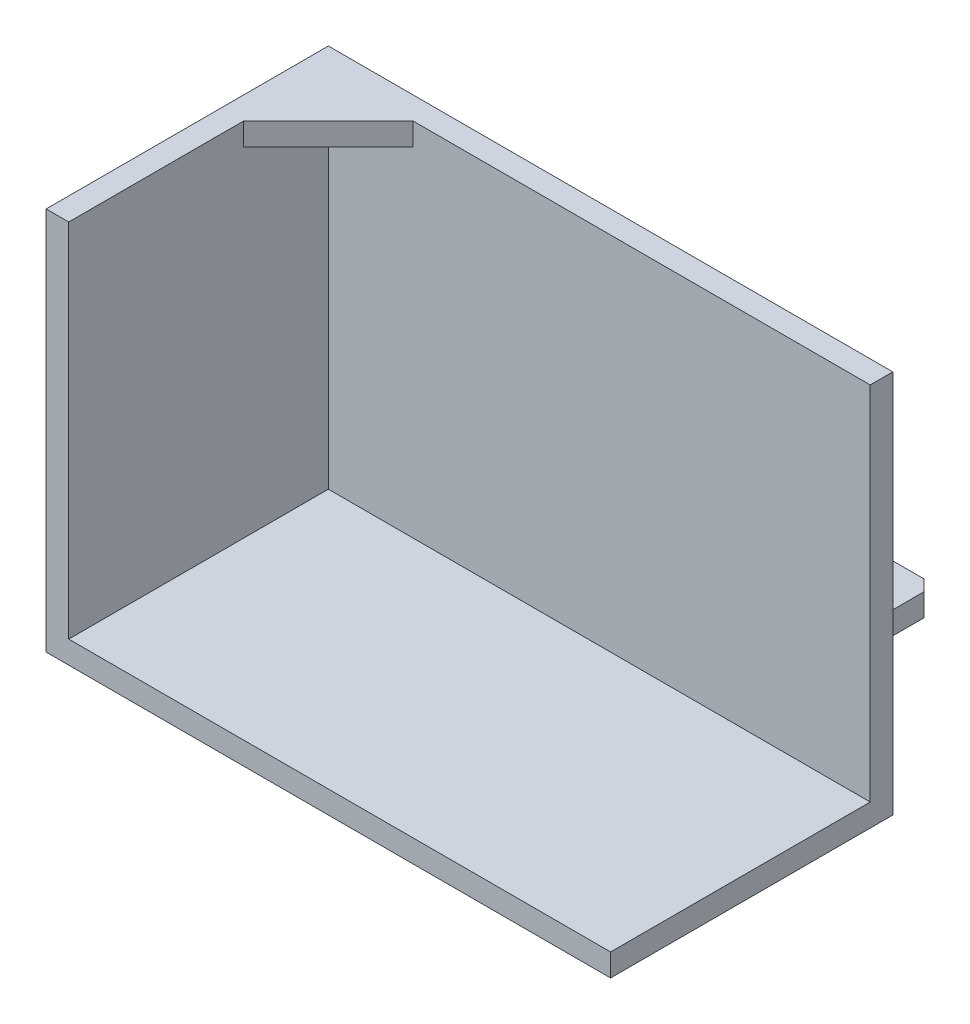
ISO-10303-21;
HEADER;
FILE_DESCRIPTION(('STEP AP214'),'2;1');
FILE_NAME('part.step','',(''),(''),'','','');
FILE_SCHEMA(('AUTOMOTIVE_DESIGN { 1 0 10303 214 1 1 1 1 }'));
ENDSEC;
DATA;
#1=APPLICATION_CONTEXT('core data for automotive mechanical design processes');
#2=APPLICATION_PROTOCOL_DEFINITION('international standard','automotive_design',2000,#1);
#3=PRODUCT_CONTEXT('',#1,'mechanical');
#4=PRODUCT('Part','Part','',(#3));
#5=PRODUCT_RELATED_PRODUCT_CATEGORY('part','',(#4));
#6=PRODUCT_DEFINITION_FORMATION('','',#4);
#7=PRODUCT_DEFINITION_CONTEXT('part definition',#1,'design');
#8=PRODUCT_DEFINITION('design','',#6,#7);
#9=PRODUCT_DEFINITION_SHAPE('','',#8);
#10=(LENGTH_UNIT() NAMED_UNIT(*) SI_UNIT(.MILLI.,.METRE.));
#11=(NAMED_UNIT(*) PLANE_ANGLE_UNIT() SI_UNIT($,.RADIAN.));
#12=(NAMED_UNIT(*) SI_UNIT($,.STERADIAN.) SOLID_ANGLE_UNIT());
#13=UNCERTAINTY_MEASURE_WITH_UNIT(LENGTH_MEASURE(1.E-05),#10,'distance_accuracy_value','');
#14=(GEOMETRIC_REPRESENTATION_CONTEXT(3) GLOBAL_UNCERTAINTY_ASSIGNED_CONTEXT((#13)) GLOBAL_UNIT_ASSIGNED_CONTEXT((#10,
#11,#12)) REPRESENTATION_CONTEXT('',''));
#15=CARTESIAN_POINT('',(0.,0.,0.));
#16=DIRECTION('',(0.,0.,1.));
#17=DIRECTION('',(1.,0.,0.));
#18=AXIS2_PLACEMENT_3D('',#15,#16,#17);
#19=CARTESIAN_POINT('',(0.,0.,0.));
#20=DIRECTION('',(0.,-1.,0.));
#21=DIRECTION('',(0.,0.,-1.));
#22=AXIS2_PLACEMENT_3D('',#19,#20,#21);
#23=PLANE('',#22);
#24=DIRECTION('',(1.,0.,0.));
#25=VECTOR('',#24,1.);
#26=CARTESIAN_POINT('',(-45.25,0.,-10.75));
#27=LINE('',#26,#25);
#28=CARTESIAN_POINT('',(-45.25,0.,-10.75));
#29=VERTEX_POINT('',#28);
#30=CARTESIAN_POINT('',(-34.75,0.,-10.75));
#31=VERTEX_POINT('',#30);
#32=EDGE_CURVE('E399',#29,#31,#27,.T.);
#33=ORIENTED_EDGE('',*,*,#32,.F.);
#34=CARTESIAN_POINT('',(-45.25,0.,-14.));
#35=DIRECTION('',(0.,1.,0.));
#36=DIRECTION('',(0.,0.,1.));
#37=AXIS2_PLACEMENT_3D('',#34,#35,#36);
#38=CIRCLE('',#37,3.24999999999999);
#39=CARTESIAN_POINT('',(-45.25,0.,-17.25));
#40=VERTEX_POINT('',#39);
#41=EDGE_CURVE('E409',#40,#29,#38,.T.);
#42=ORIENTED_EDGE('',*,*,#41,.F.);
#43=DIRECTION('',(1.,0.,0.));
#44=VECTOR('',#43,1.);
#45=CARTESIAN_POINT('',(-45.25,0.,-17.25));
#46=LINE('',#45,#44);
#47=CARTESIAN_POINT('',(-34.75,0.,-17.25));
#48=VERTEX_POINT('',#47);
#49=EDGE_CURVE('E406',#40,#48,#46,.T.);
#50=ORIENTED_EDGE('',*,*,#49,.T.);
#51=CARTESIAN_POINT('',(-34.75,0.,-14.));
#52=DIRECTION('',(0.,1.,0.));
#53=DIRECTION('',(0.,0.,1.));
#54=AXIS2_PLACEMENT_3D('',#51,#52,#53);
#55=CIRCLE('',#54,3.24999999999999);
#56=EDGE_CURVE('E419',#31,#48,#55,.T.);
#57=ORIENTED_EDGE('',*,*,#56,.F.);
#58=EDGE_LOOP('',(#33,#42,#50,#57));
#59=FACE_BOUND('',#58,.T.);
#60=DIRECTION('',(-0.707106781186552,0.,0.707106781186543));
#61=VECTOR('',#60,1.);
#62=CARTESIAN_POINT('',(-33.2499999999996,0.,-33.2500000000001));
#63=LINE('',#62,#61);
#64=CARTESIAN_POINT('',(-52.5,0.,-13.9999999999999));
#65=VERTEX_POINT('',#64);
#66=CARTESIAN_POINT('',(-59.5,0.,-6.99999999999999));
#67=VERTEX_POINT('',#66);
#68=EDGE_CURVE('E533',#65,#67,#63,.T.);
#69=ORIENTED_EDGE('',*,*,#68,.T.);
#70=DIRECTION('',(-1.,0.,0.));
#71=VECTOR('',#70,1.);
#72=CARTESIAN_POINT('',(-17.5000000000001,0.,-7.));
#73=LINE('',#72,#71);
#74=CARTESIAN_POINT('',(-20.5,0.,-7.));
#75=VERTEX_POINT('',#74);
#76=EDGE_CURVE('E204',#67,#75,#73,.F.);
#77=ORIENTED_EDGE('',*,*,#76,.T.);
#78=DIRECTION('',(-0.707106781186544,0.,-0.707106781186552));
#79=VECTOR('',#78,1.);
#80=CARTESIAN_POINT('',(-6.75000000000013,0.,6.75000000000005));
#81=LINE('',#80,#79);
#82=CARTESIAN_POINT('',(-27.5,0.,-14.0000000000001));
#83=VERTEX_POINT('',#82);
#84=EDGE_CURVE('E529',#75,#83,#81,.T.);
#85=ORIENTED_EDGE('',*,*,#84,.T.);
#86=DIRECTION('',(0.,0.,1.));
#87=VECTOR('',#86,1.);
#88=CARTESIAN_POINT('',(-27.5,0.,-3.99999999999998));
#89=LINE('',#88,#87);
#90=CARTESIAN_POINT('',(-27.5,0.,-37.));
#91=VERTEX_POINT('',#90);
#92=EDGE_CURVE('E438',#91,#83,#89,.T.);
#93=ORIENTED_EDGE('',*,*,#92,.F.);
#94=DIRECTION('',(0.707106781186545,0.,0.70710678118655));
#95=VECTOR('',#94,1.);
#96=CARTESIAN_POINT('',(-29.5,0.,-39.));
#97=LINE('',#96,#95);
#98=CARTESIAN_POINT('',(-29.5,0.,-39.));
#99=VERTEX_POINT('',#98);
#100=EDGE_CURVE('E548',#91,#99,#97,.F.);
#101=ORIENTED_EDGE('',*,*,#100,.T.);
#102=DIRECTION('',(1.,0.,0.));
#103=VECTOR('',#102,1.);
#104=CARTESIAN_POINT('',(-52.5,0.,-39.));
#105=LINE('',#104,#103);
#106=CARTESIAN_POINT('',(-50.5,0.,-39.));
#107=VERTEX_POINT('',#106);
#108=EDGE_CURVE('E434',#107,#99,#105,.T.);
#109=ORIENTED_EDGE('',*,*,#108,.F.);
#110=DIRECTION('',(0.70710678118655,0.,-0.707106781186545));
#111=VECTOR('',#110,1.);
#112=CARTESIAN_POINT('',(-52.5,0.,-37.));
#113=LINE('',#112,#111);
#114=CARTESIAN_POINT('',(-52.5,0.,-37.));
#115=VERTEX_POINT('',#114);
#116=EDGE_CURVE('E546',#107,#115,#113,.F.);
#117=ORIENTED_EDGE('',*,*,#116,.T.);
#118=DIRECTION('',(0.,0.,-1.));
#119=VECTOR('',#118,1.);
#120=CARTESIAN_POINT('',(-52.5,0.,-3.99999999999999));
#121=LINE('',#120,#119);
#122=EDGE_CURVE('E431',#65,#115,#121,.T.);
#123=ORIENTED_EDGE('',*,*,#122,.F.);
#124=EDGE_LOOP('',(#69,#77,#85,#93,#101,#109,#117,#123));
#125=FACE_BOUND('',#124,.T.);
#126=DIRECTION('',(1.,0.,0.));
#127=VECTOR('',#126,1.);
#128=CARTESIAN_POINT('',(-45.25,0.,-25.75));
#129=LINE('',#128,#127);
#130=CARTESIAN_POINT('',(-45.25,0.,-25.75));
#131=VERTEX_POINT('',#130);
#132=CARTESIAN_POINT('',(-34.75,0.,-25.75));
#133=VERTEX_POINT('',#132);
#134=EDGE_CURVE('E385',#131,#133,#129,.T.);
#135=ORIENTED_EDGE('',*,*,#134,.F.);
#136=CARTESIAN_POINT('',(-45.25,0.,-29.));
#137=DIRECTION('',(0.,1.,0.));
#138=DIRECTION('',(0.,0.,1.));
#139=AXIS2_PLACEMENT_3D('',#136,#137,#138);
#140=CIRCLE('',#139,3.24999999999999);
#141=CARTESIAN_POINT('',(-45.25,0.,-32.25));
#142=VERTEX_POINT('',#141);
#143=EDGE_CURVE('E372',#142,#131,#140,.T.);
#144=ORIENTED_EDGE('',*,*,#143,.F.);
#145=DIRECTION('',(1.,0.,0.));
#146=VECTOR('',#145,1.);
#147=CARTESIAN_POINT('',(-45.25,0.,-32.25));
#148=LINE('',#147,#146);
#149=CARTESIAN_POINT('',(-34.75,0.,-32.25));
#150=VERTEX_POINT('',#149);
#151=EDGE_CURVE('E362',#142,#150,#148,.T.);
#152=ORIENTED_EDGE('',*,*,#151,.T.);
#153=CARTESIAN_POINT('',(-34.75,0.,-29.));
#154=DIRECTION('',(0.,1.,0.));
#155=DIRECTION('',(0.,0.,1.));
#156=AXIS2_PLACEMENT_3D('',#153,#154,#155);
#157=CIRCLE('',#156,3.24999999999999);
#158=EDGE_CURVE('E382',#133,#150,#157,.T.);
#159=ORIENTED_EDGE('',*,*,#158,.F.);
#160=EDGE_LOOP('',(#135,#144,#152,#159));
#161=FACE_BOUND('',#160,.T.);
#162=ADVANCED_FACE('F189',(#59,#125,#161),#23,.F.);
#163=CARTESIAN_POINT('',(0.,64.,-4.));
#164=DIRECTION('',(0.,0.,1.));
#165=DIRECTION('',(1.,0.,0.));
#166=AXIS2_PLACEMENT_3D('',#163,#164,#165);
#167=PLANE('',#166);
#168=DIRECTION('',(-1.,0.,0.));
#169=VECTOR('',#168,1.);
#170=CARTESIAN_POINT('',(-62.5000000000001,3.,-3.99999999999999));
#171=LINE('',#170,#169);
#172=CARTESIAN_POINT('',(-17.5000000000001,3.,-4.));
#173=VERTEX_POINT('',#172);
#174=CARTESIAN_POINT('',(-62.5000000000001,3.,-3.99999999999999));
#175=VERTEX_POINT('',#174);
#176=EDGE_CURVE('E553',#173,#175,#171,.T.);
#177=ORIENTED_EDGE('',*,*,#176,.T.);
#178=DIRECTION('',(0.,-1.,0.));
#179=VECTOR('',#178,1.);
#180=CARTESIAN_POINT('',(-62.5000000000001,64.,-3.99999999999999));
#181=LINE('',#180,#179);
#182=CARTESIAN_POINT('',(-62.5000000000001,-4.,-3.99999999999999));
#183=VERTEX_POINT('',#182);
#184=EDGE_CURVE('E520',#175,#183,#181,.T.);
#185=ORIENTED_EDGE('',*,*,#184,.T.);
#186=DIRECTION('',(1.,0.,0.));
#187=VECTOR('',#186,1.);
#188=CARTESIAN_POINT('',(-100.,-4.,-3.99999999999999));
#189=LINE('',#188,#187);
#190=CARTESIAN_POINT('',(-100.,-4.,-3.99999999999999));
#191=VERTEX_POINT('',#190);
#192=EDGE_CURVE('E469',#191,#183,#189,.T.);
#193=ORIENTED_EDGE('',*,*,#192,.F.);
#194=DIRECTION('',(0.,-1.,0.));
#195=VECTOR('',#194,1.);
#196=CARTESIAN_POINT('',(-100.,64.,-3.99999999999999));
#197=LINE('',#196,#195);
#198=CARTESIAN_POINT('',(-100.,64.,-3.99999999999999));
#199=VERTEX_POINT('',#198);
#200=EDGE_CURVE('E509',#199,#191,#197,.T.);
#201=ORIENTED_EDGE('',*,*,#200,.F.);
#202=DIRECTION('',(-1.,0.,0.));
#203=VECTOR('',#202,1.);
#204=CARTESIAN_POINT('',(0.,64.,-4.));
#205=LINE('',#204,#203);
#206=CARTESIAN_POINT('',(0.,64.,-4.));
#207=VERTEX_POINT('',#206);
#208=EDGE_CURVE('E489',#207,#199,#205,.T.);
#209=ORIENTED_EDGE('',*,*,#208,.F.);
#210=DIRECTION('',(0.,-1.,0.));
#211=VECTOR('',#210,1.);
#212=CARTESIAN_POINT('',(0.,64.,-4.));
#213=LINE('',#212,#211);
#214=CARTESIAN_POINT('',(0.,-4.,-4.));
#215=VERTEX_POINT('',#214);
#216=EDGE_CURVE('E511',#207,#215,#213,.T.);
#217=ORIENTED_EDGE('',*,*,#216,.T.);
#218=CARTESIAN_POINT('',(-17.5000000000001,-4.,-4.));
#219=VERTEX_POINT('',#218);
#220=EDGE_CURVE('E467',#219,#215,#189,.T.);
#221=ORIENTED_EDGE('',*,*,#220,.F.);
#222=DIRECTION('',(0.,1.,0.));
#223=VECTOR('',#222,1.);
#224=CARTESIAN_POINT('',(-17.5000000000001,64.,-4.));
#225=LINE('',#224,#223);
#226=EDGE_CURVE('E523',#219,#173,#225,.T.);
#227=ORIENTED_EDGE('',*,*,#226,.T.);
#228=EDGE_LOOP('',(#177,#185,#193,#201,#209,#217,#221,#227));
#229=FACE_BOUND('',#228,.T.);
#230=ADVANCED_FACE('F558',(#229),#167,.F.);
#231=CARTESIAN_POINT('',(-96.,64.,0.));
#232=DIRECTION('',(0.,0.,-1.));
#233=DIRECTION('',(-1.,0.,0.));
#234=AXIS2_PLACEMENT_3D('',#231,#232,#233);
#235=PLANE('',#234);
#236=DIRECTION('',(1.,0.,0.));
#237=VECTOR('',#236,1.);
#238=CARTESIAN_POINT('',(-96.,64.,0.));
#239=LINE('',#238,#237);
#240=CARTESIAN_POINT('',(-81.,64.,0.));
#241=VERTEX_POINT('',#240);
#242=CARTESIAN_POINT('',(0.,64.,0.));
#243=VERTEX_POINT('',#242);
#244=EDGE_CURVE('E484',#241,#243,#239,.T.);
#245=ORIENTED_EDGE('',*,*,#244,.F.);
#246=DIRECTION('',(0.,1.,0.));
#247=VECTOR('',#246,1.);
#248=CARTESIAN_POINT('',(-81.,60.,0.));
#249=LINE('',#248,#247);
#250=CARTESIAN_POINT('',(-81.,60.,0.));
#251=VERTEX_POINT('',#250);
#252=EDGE_CURVE('E458',#251,#241,#249,.T.);
#253=ORIENTED_EDGE('',*,*,#252,.F.);
#254=DIRECTION('',(-1.,0.,0.));
#255=VECTOR('',#254,1.);
#256=CARTESIAN_POINT('',(-96.,60.,0.));
#257=LINE('',#256,#255);
#258=CARTESIAN_POINT('',(-96.,60.,0.));
#259=VERTEX_POINT('',#258);
#260=EDGE_CURVE('E453',#251,#259,#257,.T.);
#261=ORIENTED_EDGE('',*,*,#260,.T.);
#262=DIRECTION('',(0.,-1.,0.));
#263=VECTOR('',#262,1.);
#264=CARTESIAN_POINT('',(-96.,64.,0.));
#265=LINE('',#264,#263);
#266=CARTESIAN_POINT('',(-96.,0.,0.));
#267=VERTEX_POINT('',#266);
#268=EDGE_CURVE('E498',#259,#267,#265,.T.);
#269=ORIENTED_EDGE('',*,*,#268,.T.);
#270=DIRECTION('',(1.,0.,0.));
#271=VECTOR('',#270,1.);
#272=CARTESIAN_POINT('',(-96.,0.,0.));
#273=LINE('',#272,#271);
#274=CARTESIAN_POINT('',(0.,0.,0.));
#275=VERTEX_POINT('',#274);
#276=EDGE_CURVE('E483',#267,#275,#273,.T.);
#277=ORIENTED_EDGE('',*,*,#276,.T.);
#278=DIRECTION('',(0.,-1.,0.));
#279=VECTOR('',#278,1.);
#280=CARTESIAN_POINT('',(0.,64.,0.));
#281=LINE('',#280,#279);
#282=EDGE_CURVE('E514',#243,#275,#281,.T.);
#283=ORIENTED_EDGE('',*,*,#282,.F.);
#284=EDGE_LOOP('',(#245,#253,#261,#269,#277,#283));
#285=FACE_BOUND('',#284,.T.);
#286=ADVANCED_FACE('F626',(#285),#235,.F.);
#287=CARTESIAN_POINT('',(0.,64.,0.));
#288=DIRECTION('',(-1.,0.,0.));
#289=DIRECTION('',(0.,0.,1.));
#290=AXIS2_PLACEMENT_3D('',#287,#288,#289);
#291=PLANE('',#290);
#292=ORIENTED_EDGE('',*,*,#282,.T.);
#293=DIRECTION('',(0.,0.,1.));
#294=VECTOR('',#293,1.);
#295=CARTESIAN_POINT('',(0.,0.,-4.));
#296=LINE('',#295,#294);
#297=CARTESIAN_POINT('',(0.,0.,46.));
#298=VERTEX_POINT('',#297);
#299=EDGE_CURVE('E461',#275,#298,#296,.T.);
#300=ORIENTED_EDGE('',*,*,#299,.T.);
#301=DIRECTION('',(0.,1.,0.));
#302=VECTOR('',#301,1.);
#303=CARTESIAN_POINT('',(0.,-4.,46.));
#304=LINE('',#303,#302);
#305=CARTESIAN_POINT('',(0.,-4.,46.));
#306=VERTEX_POINT('',#305);
#307=EDGE_CURVE('E477',#306,#298,#304,.T.);
#308=ORIENTED_EDGE('',*,*,#307,.F.);
#309=DIRECTION('',(0.,0.,1.));
#310=VECTOR('',#309,1.);
#311=CARTESIAN_POINT('',(0.,-4.,-4.));
#312=LINE('',#311,#310);
#313=EDGE_CURVE('E472',#215,#306,#312,.T.);
#314=ORIENTED_EDGE('',*,*,#313,.F.);
#315=ORIENTED_EDGE('',*,*,#216,.F.);
#316=DIRECTION('',(0.,0.,-1.));
#317=VECTOR('',#316,1.);
#318=CARTESIAN_POINT('',(0.,64.,0.));
#319=LINE('',#318,#317);
#320=EDGE_CURVE('E486',#243,#207,#319,.T.);
#321=ORIENTED_EDGE('',*,*,#320,.F.);
#322=EDGE_LOOP('',(#292,#300,#308,#314,#315,#321));
#323=FACE_BOUND('',#322,.T.);
#324=ADVANCED_FACE('F611',(#323),#291,.F.);
#325=CARTESIAN_POINT('',(-100.,64.,-3.99999999999999));
#326=DIRECTION('',(1.,0.,0.));
#327=DIRECTION('',(0.,0.,-1.));
#328=AXIS2_PLACEMENT_3D('',#325,#326,#327);
#329=PLANE('',#328);
#330=ORIENTED_EDGE('',*,*,#200,.T.);
#331=DIRECTION('',(0.,0.,-1.));
#332=VECTOR('',#331,1.);
#333=CARTESIAN_POINT('',(-100.,-4.,-3.99999999999999));
#334=LINE('',#333,#332);
#335=CARTESIAN_POINT('',(-100.,-4.,46.));
#336=VERTEX_POINT('',#335);
#337=EDGE_CURVE('E464',#336,#191,#334,.T.);
#338=ORIENTED_EDGE('',*,*,#337,.F.);
#339=DIRECTION('',(0.,-1.,0.));
#340=VECTOR('',#339,1.);
#341=CARTESIAN_POINT('',(-100.,64.,46.));
#342=LINE('',#341,#340);
#343=CARTESIAN_POINT('',(-100.,64.,46.));
#344=VERTEX_POINT('',#343);
#345=EDGE_CURVE('E507',#344,#336,#342,.T.);
#346=ORIENTED_EDGE('',*,*,#345,.F.);
#347=DIRECTION('',(0.,0.,1.));
#348=VECTOR('',#347,1.);
#349=CARTESIAN_POINT('',(-100.,64.,-3.99999999999999));
#350=LINE('',#349,#348);
#351=EDGE_CURVE('E491',#199,#344,#350,.T.);
#352=ORIENTED_EDGE('',*,*,#351,.F.);
#353=EDGE_LOOP('',(#330,#338,#346,#352));
#354=FACE_BOUND('',#353,.T.);
#355=ADVANCED_FACE('F600',(#354),#329,.F.);
#356=CARTESIAN_POINT('',(-100.,64.,46.));
#357=DIRECTION('',(0.,0.,-1.));
#358=DIRECTION('',(-1.,0.,0.));
#359=AXIS2_PLACEMENT_3D('',#356,#357,#358);
#360=PLANE('',#359);
#361=ORIENTED_EDGE('',*,*,#345,.T.);
#362=DIRECTION('',(-1.,0.,0.));
#363=VECTOR('',#362,1.);
#364=CARTESIAN_POINT('',(-100.,-4.,46.));
#365=LINE('',#364,#363);
#366=EDGE_CURVE('E474',#306,#336,#365,.T.);
#367=ORIENTED_EDGE('',*,*,#366,.F.);
#368=ORIENTED_EDGE('',*,*,#307,.T.);
#369=DIRECTION('',(-1.,0.,0.));
#370=VECTOR('',#369,1.);
#371=CARTESIAN_POINT('',(-100.,0.,46.));
#372=LINE('',#371,#370);
#373=CARTESIAN_POINT('',(-96.,0.,46.));
#374=VERTEX_POINT('',#373);
#375=EDGE_CURVE('E468',#298,#374,#372,.T.);
#376=ORIENTED_EDGE('',*,*,#375,.T.);
#377=DIRECTION('',(0.,-1.,0.));
#378=VECTOR('',#377,1.);
#379=CARTESIAN_POINT('',(-96.,64.,46.));
#380=LINE('',#379,#378);
#381=CARTESIAN_POINT('',(-96.,64.,46.));
#382=VERTEX_POINT('',#381);
#383=EDGE_CURVE('E504',#382,#374,#380,.T.);
#384=ORIENTED_EDGE('',*,*,#383,.F.);
#385=DIRECTION('',(1.,0.,0.));
#386=VECTOR('',#385,1.);
#387=CARTESIAN_POINT('',(-100.,64.,46.));
#388=LINE('',#387,#386);
#389=EDGE_CURVE('E493',#344,#382,#388,.T.);
#390=ORIENTED_EDGE('',*,*,#389,.F.);
#391=EDGE_LOOP('',(#361,#367,#368,#376,#384,#390));
#392=FACE_BOUND('',#391,.T.);
#393=ADVANCED_FACE('F616',(#392),#360,.F.);
#394=CARTESIAN_POINT('',(-96.,64.,46.));
#395=DIRECTION('',(-1.,0.,0.));
#396=DIRECTION('',(0.,0.,1.));
#397=AXIS2_PLACEMENT_3D('',#394,#395,#396);
#398=PLANE('',#397);
#399=DIRECTION('',(0.,0.,1.));
#400=VECTOR('',#399,1.);
#401=CARTESIAN_POINT('',(-96.,60.,15.));
#402=LINE('',#401,#400);
#403=CARTESIAN_POINT('',(-96.,60.,15.));
#404=VERTEX_POINT('',#403);
#405=EDGE_CURVE('E448',#259,#404,#402,.T.);
#406=ORIENTED_EDGE('',*,*,#405,.T.);
#407=DIRECTION('',(0.,1.,0.));
#408=VECTOR('',#407,1.);
#409=CARTESIAN_POINT('',(-96.,60.,15.));
#410=LINE('',#409,#408);
#411=CARTESIAN_POINT('',(-96.,64.,15.));
#412=VERTEX_POINT('',#411);
#413=EDGE_CURVE('E456',#404,#412,#410,.T.);
#414=ORIENTED_EDGE('',*,*,#413,.T.);
#415=DIRECTION('',(0.,0.,-1.));
#416=VECTOR('',#415,1.);
#417=CARTESIAN_POINT('',(-96.,64.,46.));
#418=LINE('',#417,#416);
#419=EDGE_CURVE('E495',#382,#412,#418,.T.);
#420=ORIENTED_EDGE('',*,*,#419,.F.);
#421=ORIENTED_EDGE('',*,*,#383,.T.);
#422=DIRECTION('',(0.,0.,-1.));
#423=VECTOR('',#422,1.);
#424=CARTESIAN_POINT('',(-96.,0.,46.));
#425=LINE('',#424,#423);
#426=EDGE_CURVE('E487',#374,#267,#425,.T.);
#427=ORIENTED_EDGE('',*,*,#426,.T.);
#428=ORIENTED_EDGE('',*,*,#268,.F.);
#429=EDGE_LOOP('',(#406,#414,#420,#421,#427,#428));
#430=FACE_BOUND('',#429,.T.);
#431=ADVANCED_FACE('F619',(#430),#398,.F.);
#432=CARTESIAN_POINT('',(0.,64.,0.));
#433=DIRECTION('',(0.,1.,0.));
#434=DIRECTION('',(0.,0.,1.));
#435=AXIS2_PLACEMENT_3D('',#432,#433,#434);
#436=PLANE('',#435);
#437=ORIENTED_EDGE('',*,*,#419,.T.);
#438=DIRECTION('',(0.707106781186547,0.,-0.707106781186547));
#439=VECTOR('',#438,1.);
#440=CARTESIAN_POINT('',(-81.,64.,0.));
#441=LINE('',#440,#439);
#442=EDGE_CURVE('E441',#412,#241,#441,.T.);
#443=ORIENTED_EDGE('',*,*,#442,.T.);
#444=ORIENTED_EDGE('',*,*,#244,.T.);
#445=ORIENTED_EDGE('',*,*,#320,.T.);
#446=ORIENTED_EDGE('',*,*,#208,.T.);
#447=ORIENTED_EDGE('',*,*,#351,.T.);
#448=ORIENTED_EDGE('',*,*,#389,.T.);
#449=EDGE_LOOP('',(#437,#443,#444,#445,#446,#447,#448));
#450=FACE_BOUND('',#449,.T.);
#451=ADVANCED_FACE('F603',(#450),#436,.T.);
#452=CARTESIAN_POINT('',(0.,0.,0.));
#453=DIRECTION('',(0.,1.,0.));
#454=DIRECTION('',(0.,0.,1.));
#455=AXIS2_PLACEMENT_3D('',#452,#453,#454);
#456=PLANE('',#455);
#457=ORIENTED_EDGE('',*,*,#276,.F.);
#458=ORIENTED_EDGE('',*,*,#426,.F.);
#459=ORIENTED_EDGE('',*,*,#375,.F.);
#460=ORIENTED_EDGE('',*,*,#299,.F.);
#461=EDGE_LOOP('',(#457,#458,#459,#460));
#462=FACE_BOUND('',#461,.T.);
#463=ADVANCED_FACE('F630',(#462),#456,.T.);
#464=CARTESIAN_POINT('',(0.,-4.,0.));
#465=DIRECTION('',(0.,1.,0.));
#466=DIRECTION('',(0.,0.,1.));
#467=AXIS2_PLACEMENT_3D('',#464,#465,#466);
#468=PLANE('',#467);
#469=DIRECTION('',(1.,0.,0.));
#470=VECTOR('',#469,1.);
#471=CARTESIAN_POINT('',(-45.25,-4.,-25.75));
#472=LINE('',#471,#470);
#473=CARTESIAN_POINT('',(-45.25,-4.,-25.75));
#474=VERTEX_POINT('',#473);
#475=CARTESIAN_POINT('',(-34.75,-4.,-25.75));
#476=VERTEX_POINT('',#475);
#477=EDGE_CURVE('E706',#474,#476,#472,.T.);
#478=ORIENTED_EDGE('',*,*,#477,.T.);
#479=CARTESIAN_POINT('',(-34.75,-4.,-29.));
#480=DIRECTION('',(0.,1.,0.));
#481=DIRECTION('',(0.,0.,1.));
#482=AXIS2_PLACEMENT_3D('',#479,#480,#481);
#483=CIRCLE('',#482,3.25);
#484=CARTESIAN_POINT('',(-34.75,-4.,-32.25));
#485=VERTEX_POINT('',#484);
#486=EDGE_CURVE('E392',#476,#485,#483,.T.);
#487=ORIENTED_EDGE('',*,*,#486,.T.);
#488=DIRECTION('',(1.,0.,0.));
#489=VECTOR('',#488,1.);
#490=CARTESIAN_POINT('',(-45.25,-4.,-32.25));
#491=LINE('',#490,#489);
#492=CARTESIAN_POINT('',(-45.25,-4.,-32.25));
#493=VERTEX_POINT('',#492);
#494=EDGE_CURVE('E373',#493,#485,#491,.T.);
#495=ORIENTED_EDGE('',*,*,#494,.F.);
#496=CARTESIAN_POINT('',(-45.25,-4.,-29.));
#497=DIRECTION('',(0.,1.,0.));
#498=DIRECTION('',(0.,0.,1.));
#499=AXIS2_PLACEMENT_3D('',#496,#497,#498);
#500=CIRCLE('',#499,3.25);
#501=EDGE_CURVE('E380',#493,#474,#500,.T.);
#502=ORIENTED_EDGE('',*,*,#501,.T.);
#503=EDGE_LOOP('',(#478,#487,#495,#502));
#504=FACE_BOUND('',#503,.T.);
#505=CARTESIAN_POINT('',(-34.75,-4.,-14.));
#506=DIRECTION('',(0.,1.,0.));
#507=DIRECTION('',(0.,0.,1.));
#508=AXIS2_PLACEMENT_3D('',#505,#506,#507);
#509=CIRCLE('',#508,3.25);
#510=CARTESIAN_POINT('',(-34.75,-4.,-10.75));
#511=VERTEX_POINT('',#510);
#512=CARTESIAN_POINT('',(-34.75,-4.,-17.25));
#513=VERTEX_POINT('',#512);
#514=EDGE_CURVE('E422',#511,#513,#509,.T.);
#515=ORIENTED_EDGE('',*,*,#514,.T.);
#516=DIRECTION('',(1.,0.,0.));
#517=VECTOR('',#516,1.);
#518=CARTESIAN_POINT('',(-45.25,-4.,-17.25));
#519=LINE('',#518,#517);
#520=CARTESIAN_POINT('',(-45.25,-4.,-17.25));
#521=VERTEX_POINT('',#520);
#522=EDGE_CURVE('E404',#521,#513,#519,.T.);
#523=ORIENTED_EDGE('',*,*,#522,.F.);
#524=CARTESIAN_POINT('',(-45.25,-4.,-14.));
#525=DIRECTION('',(0.,1.,0.));
#526=DIRECTION('',(0.,0.,1.));
#527=AXIS2_PLACEMENT_3D('',#524,#525,#526);
#528=CIRCLE('',#527,3.25);
#529=CARTESIAN_POINT('',(-45.25,-4.,-10.75));
#530=VERTEX_POINT('',#529);
#531=EDGE_CURVE('E412',#521,#530,#528,.T.);
#532=ORIENTED_EDGE('',*,*,#531,.T.);
#533=DIRECTION('',(1.,0.,0.));
#534=VECTOR('',#533,1.);
#535=CARTESIAN_POINT('',(-45.25,-4.,-10.75));
#536=LINE('',#535,#534);
#537=EDGE_CURVE('E401',#530,#511,#536,.T.);
#538=ORIENTED_EDGE('',*,*,#537,.T.);
#539=EDGE_LOOP('',(#515,#523,#532,#538));
#540=FACE_BOUND('',#539,.T.);
#541=DIRECTION('',(1.,0.,0.));
#542=VECTOR('',#541,1.);
#543=CARTESIAN_POINT('',(-52.5,-4.,-39.));
#544=LINE('',#543,#542);
#545=CARTESIAN_POINT('',(-50.5,-4.,-39.));
#546=VERTEX_POINT('',#545);
#547=CARTESIAN_POINT('',(-29.5,-4.,-39.));
#548=VERTEX_POINT('',#547);
#549=EDGE_CURVE('E444',#546,#548,#544,.T.);
#550=ORIENTED_EDGE('',*,*,#549,.T.);
#551=DIRECTION('',(-0.707106781186545,0.,-0.70710678118655));
#552=VECTOR('',#551,1.);
#553=CARTESIAN_POINT('',(-29.5,-4.,-39.));
#554=LINE('',#553,#552);
#555=CARTESIAN_POINT('',(-27.5,-4.,-37.));
#556=VERTEX_POINT('',#555);
#557=EDGE_CURVE('E542',#548,#556,#554,.F.);
#558=ORIENTED_EDGE('',*,*,#557,.T.);
#559=DIRECTION('',(0.,0.,1.));
#560=VECTOR('',#559,1.);
#561=CARTESIAN_POINT('',(-27.5,-4.,-3.99999999999998));
#562=LINE('',#561,#560);
#563=CARTESIAN_POINT('',(-27.5,-4.,-14.0000000000001));
#564=VERTEX_POINT('',#563);
#565=EDGE_CURVE('E435',#556,#564,#562,.T.);
#566=ORIENTED_EDGE('',*,*,#565,.T.);
#567=DIRECTION('',(0.707106781186544,0.,0.707106781186552));
#568=VECTOR('',#567,1.);
#569=CARTESIAN_POINT('',(-6.75000000000013,-4.,6.75000000000005));
#570=LINE('',#569,#568);
#571=EDGE_CURVE('E527',#564,#219,#570,.T.);
#572=ORIENTED_EDGE('',*,*,#571,.T.);
#573=ORIENTED_EDGE('',*,*,#220,.T.);
#574=ORIENTED_EDGE('',*,*,#313,.T.);
#575=ORIENTED_EDGE('',*,*,#366,.T.);
#576=ORIENTED_EDGE('',*,*,#337,.T.);
#577=ORIENTED_EDGE('',*,*,#192,.T.);
#578=DIRECTION('',(0.707106781186552,0.,-0.707106781186543));
#579=VECTOR('',#578,1.);
#580=CARTESIAN_POINT('',(-33.2499999999996,-4.,-33.2500000000001));
#581=LINE('',#580,#579);
#582=CARTESIAN_POINT('',(-52.5,-4.,-13.9999999999999));
#583=VERTEX_POINT('',#582);
#584=EDGE_CURVE('E531',#183,#583,#581,.T.);
#585=ORIENTED_EDGE('',*,*,#584,.T.);
#586=DIRECTION('',(0.,0.,-1.));
#587=VECTOR('',#586,1.);
#588=CARTESIAN_POINT('',(-52.5,-4.,-3.99999999999999));
#589=LINE('',#588,#587);
#590=CARTESIAN_POINT('',(-52.5,-4.,-37.));
#591=VERTEX_POINT('',#590);
#592=EDGE_CURVE('E430',#583,#591,#589,.T.);
#593=ORIENTED_EDGE('',*,*,#592,.T.);
#594=DIRECTION('',(-0.70710678118655,0.,0.707106781186545));
#595=VECTOR('',#594,1.);
#596=CARTESIAN_POINT('',(-52.5,-4.,-37.));
#597=LINE('',#596,#595);
#598=EDGE_CURVE('E540',#591,#546,#597,.F.);
#599=ORIENTED_EDGE('',*,*,#598,.T.);
#600=EDGE_LOOP('',(#550,#558,#566,#572,#573,#574,#575,#576,#577,#585,#593,#599));
#601=FACE_BOUND('',#600,.T.);
#602=ADVANCED_FACE('F593',(#504,#540,#601),#468,.F.);
#603=CARTESIAN_POINT('',(-81.,60.,0.));
#604=DIRECTION('',(0.707106781186547,0.,0.707106781186547));
#605=DIRECTION('',(0.707106781186548,0.,-0.707106781186548));
#606=AXIS2_PLACEMENT_3D('',#603,#604,#605);
#607=PLANE('',#606);
#608=ORIENTED_EDGE('',*,*,#442,.F.);
#609=ORIENTED_EDGE('',*,*,#413,.F.);
#610=DIRECTION('',(0.707106781186547,0.,-0.707106781186547));
#611=VECTOR('',#610,1.);
#612=CARTESIAN_POINT('',(-81.,60.,0.));
#613=LINE('',#612,#611);
#614=EDGE_CURVE('E451',#404,#251,#613,.T.);
#615=ORIENTED_EDGE('',*,*,#614,.T.);
#616=ORIENTED_EDGE('',*,*,#252,.T.);
#617=EDGE_LOOP('',(#608,#609,#615,#616));
#618=FACE_BOUND('',#617,.T.);
#619=ADVANCED_FACE('F622',(#618),#607,.T.);
#620=CARTESIAN_POINT('',(0.,60.,0.));
#621=DIRECTION('',(0.,-1.,0.));
#622=DIRECTION('',(0.,0.,-1.));
#623=AXIS2_PLACEMENT_3D('',#620,#621,#622);
#624=PLANE('',#623);
#625=ORIENTED_EDGE('',*,*,#405,.F.);
#626=ORIENTED_EDGE('',*,*,#260,.F.);
#627=ORIENTED_EDGE('',*,*,#614,.F.);
#628=EDGE_LOOP('',(#625,#626,#627));
#629=FACE_BOUND('',#628,.T.);
#630=ADVANCED_FACE('F632',(#629),#624,.T.);
#631=CARTESIAN_POINT('',(-52.5,0.,-3.99999999999999));
#632=DIRECTION('',(-1.,0.,0.));
#633=DIRECTION('',(0.,0.,1.));
#634=AXIS2_PLACEMENT_3D('',#631,#632,#633);
#635=PLANE('',#634);
#636=ORIENTED_EDGE('',*,*,#122,.T.);
#637=DIRECTION('',(0.,-1.,0.));
#638=VECTOR('',#637,1.);
#639=CARTESIAN_POINT('',(-52.5,0.,-37.));
#640=LINE('',#639,#638);
#641=EDGE_CURVE('E550',#115,#591,#640,.T.);
#642=ORIENTED_EDGE('',*,*,#641,.T.);
#643=ORIENTED_EDGE('',*,*,#592,.F.);
#644=DIRECTION('',(0.,1.,0.));
#645=VECTOR('',#644,1.);
#646=CARTESIAN_POINT('',(-52.5,0.,-13.9999999999999));
#647=LINE('',#646,#645);
#648=EDGE_CURVE('E525',#583,#65,#647,.T.);
#649=ORIENTED_EDGE('',*,*,#648,.T.);
#650=EDGE_LOOP('',(#636,#642,#643,#649));
#651=FACE_BOUND('',#650,.T.);
#652=ADVANCED_FACE('F588',(#651),#635,.T.);
#653=CARTESIAN_POINT('',(-27.5,0.,-3.99999999999998));
#654=DIRECTION('',(1.,0.,0.));
#655=DIRECTION('',(0.,0.,-1.));
#656=AXIS2_PLACEMENT_3D('',#653,#654,#655);
#657=PLANE('',#656);
#658=ORIENTED_EDGE('',*,*,#565,.F.);
#659=DIRECTION('',(0.,1.,0.));
#660=VECTOR('',#659,1.);
#661=CARTESIAN_POINT('',(-27.5,0.,-37.));
#662=LINE('',#661,#660);
#663=EDGE_CURVE('E544',#556,#91,#662,.T.);
#664=ORIENTED_EDGE('',*,*,#663,.T.);
#665=ORIENTED_EDGE('',*,*,#92,.T.);
#666=DIRECTION('',(0.,-1.,0.));
#667=VECTOR('',#666,1.);
#668=CARTESIAN_POINT('',(-27.5,0.,-14.0000000000001));
#669=LINE('',#668,#667);
#670=EDGE_CURVE('E517',#83,#564,#669,.T.);
#671=ORIENTED_EDGE('',*,*,#670,.T.);
#672=EDGE_LOOP('',(#658,#664,#665,#671));
#673=FACE_BOUND('',#672,.T.);
#674=ADVANCED_FACE('F572',(#673),#657,.T.);
#675=CARTESIAN_POINT('',(-52.5,0.,-39.));
#676=DIRECTION('',(0.,0.,-1.));
#677=DIRECTION('',(-1.,0.,0.));
#678=AXIS2_PLACEMENT_3D('',#675,#676,#677);
#679=PLANE('',#678);
#680=ORIENTED_EDGE('',*,*,#108,.T.);
#681=DIRECTION('',(0.,-1.,0.));
#682=VECTOR('',#681,1.);
#683=CARTESIAN_POINT('',(-29.5,0.,-39.));
#684=LINE('',#683,#682);
#685=EDGE_CURVE('E537',#99,#548,#684,.T.);
#686=ORIENTED_EDGE('',*,*,#685,.T.);
#687=ORIENTED_EDGE('',*,*,#549,.F.);
#688=DIRECTION('',(0.,1.,0.));
#689=VECTOR('',#688,1.);
#690=CARTESIAN_POINT('',(-50.5,0.,-39.));
#691=LINE('',#690,#689);
#692=EDGE_CURVE('E535',#546,#107,#691,.T.);
#693=ORIENTED_EDGE('',*,*,#692,.T.);
#694=EDGE_LOOP('',(#680,#686,#687,#693));
#695=FACE_BOUND('',#694,.T.);
#696=ADVANCED_FACE('F580',(#695),#679,.T.);
#697=CARTESIAN_POINT('',(-34.75,0.,-14.));
#698=DIRECTION('',(0.,1.,0.));
#699=DIRECTION('',(0.,0.,1.));
#700=AXIS2_PLACEMENT_3D('',#697,#698,#699);
#701=CYLINDRICAL_SURFACE('',#700,3.25);
#702=ORIENTED_EDGE('',*,*,#514,.F.);
#703=DIRECTION('',(0.,1.,0.));
#704=VECTOR('',#703,1.);
#705=CARTESIAN_POINT('',(-34.75,0.,-10.75));
#706=LINE('',#705,#704);
#707=EDGE_CURVE('E427',#31,#511,#706,.F.);
#708=ORIENTED_EDGE('',*,*,#707,.F.);
#709=ORIENTED_EDGE('',*,*,#56,.T.);
#710=DIRECTION('',(0.,1.,0.));
#711=VECTOR('',#710,1.);
#712=CARTESIAN_POINT('',(-34.75,0.,-17.25));
#713=LINE('',#712,#711);
#714=EDGE_CURVE('E425',#513,#48,#713,.T.);
#715=ORIENTED_EDGE('',*,*,#714,.F.);
#716=EDGE_LOOP('',(#702,#708,#709,#715));
#717=FACE_BOUND('',#716,.T.);
#718=ADVANCED_FACE('F653',(#717),#701,.F.);
#719=CARTESIAN_POINT('',(-45.25,0.,-14.));
#720=DIRECTION('',(0.,1.,0.));
#721=DIRECTION('',(0.,0.,1.));
#722=AXIS2_PLACEMENT_3D('',#719,#720,#721);
#723=CYLINDRICAL_SURFACE('',#722,3.25);
#724=ORIENTED_EDGE('',*,*,#41,.T.);
#725=DIRECTION('',(0.,1.,0.));
#726=VECTOR('',#725,1.);
#727=CARTESIAN_POINT('',(-45.25,0.,-10.75));
#728=LINE('',#727,#726);
#729=EDGE_CURVE('E415',#530,#29,#728,.T.);
#730=ORIENTED_EDGE('',*,*,#729,.F.);
#731=ORIENTED_EDGE('',*,*,#531,.F.);
#732=DIRECTION('',(0.,1.,0.));
#733=VECTOR('',#732,1.);
#734=CARTESIAN_POINT('',(-45.25,0.,-17.25));
#735=LINE('',#734,#733);
#736=EDGE_CURVE('E417',#40,#521,#735,.F.);
#737=ORIENTED_EDGE('',*,*,#736,.F.);
#738=EDGE_LOOP('',(#724,#730,#731,#737));
#739=FACE_BOUND('',#738,.T.);
#740=ADVANCED_FACE('F661',(#739),#723,.F.);
#741=CARTESIAN_POINT('',(-45.25,0.,-17.25));
#742=DIRECTION('',(0.,0.,-1.));
#743=DIRECTION('',(-1.,0.,0.));
#744=AXIS2_PLACEMENT_3D('',#741,#742,#743);
#745=PLANE('',#744);
#746=ORIENTED_EDGE('',*,*,#714,.T.);
#747=ORIENTED_EDGE('',*,*,#49,.F.);
#748=ORIENTED_EDGE('',*,*,#736,.T.);
#749=ORIENTED_EDGE('',*,*,#522,.T.);
#750=EDGE_LOOP('',(#746,#747,#748,#749));
#751=FACE_BOUND('',#750,.T.);
#752=ADVANCED_FACE('F666',(#751),#745,.F.);
#753=CARTESIAN_POINT('',(-45.25,0.,-10.75));
#754=DIRECTION('',(0.,0.,1.));
#755=DIRECTION('',(1.,0.,0.));
#756=AXIS2_PLACEMENT_3D('',#753,#754,#755);
#757=PLANE('',#756);
#758=ORIENTED_EDGE('',*,*,#707,.T.);
#759=ORIENTED_EDGE('',*,*,#537,.F.);
#760=ORIENTED_EDGE('',*,*,#729,.T.);
#761=ORIENTED_EDGE('',*,*,#32,.T.);
#762=EDGE_LOOP('',(#758,#759,#760,#761));
#763=FACE_BOUND('',#762,.T.);
#764=ADVANCED_FACE('F675',(#763),#757,.F.);
#765=CARTESIAN_POINT('',(-34.75,0.,-29.));
#766=DIRECTION('',(0.,1.,0.));
#767=DIRECTION('',(0.,0.,1.));
#768=AXIS2_PLACEMENT_3D('',#765,#766,#767);
#769=CYLINDRICAL_SURFACE('',#768,3.25);
#770=ORIENTED_EDGE('',*,*,#486,.F.);
#771=DIRECTION('',(0.,1.,0.));
#772=VECTOR('',#771,1.);
#773=CARTESIAN_POINT('',(-34.75,0.,-25.75));
#774=LINE('',#773,#772);
#775=EDGE_CURVE('E396',#133,#476,#774,.F.);
#776=ORIENTED_EDGE('',*,*,#775,.F.);
#777=ORIENTED_EDGE('',*,*,#158,.T.);
#778=DIRECTION('',(0.,1.,0.));
#779=VECTOR('',#778,1.);
#780=CARTESIAN_POINT('',(-34.75,0.,-32.25));
#781=LINE('',#780,#779);
#782=EDGE_CURVE('E368',#485,#150,#781,.T.);
#783=ORIENTED_EDGE('',*,*,#782,.F.);
#784=EDGE_LOOP('',(#770,#776,#777,#783));
#785=FACE_BOUND('',#784,.T.);
#786=ADVANCED_FACE('F685',(#785),#769,.F.);
#787=CARTESIAN_POINT('',(-45.25,0.,-29.));
#788=DIRECTION('',(0.,1.,0.));
#789=DIRECTION('',(0.,0.,1.));
#790=AXIS2_PLACEMENT_3D('',#787,#788,#789);
#791=CYLINDRICAL_SURFACE('',#790,3.25);
#792=ORIENTED_EDGE('',*,*,#143,.T.);
#793=DIRECTION('',(0.,1.,0.));
#794=VECTOR('',#793,1.);
#795=CARTESIAN_POINT('',(-45.25,0.,-25.75));
#796=LINE('',#795,#794);
#797=EDGE_CURVE('E383',#474,#131,#796,.T.);
#798=ORIENTED_EDGE('',*,*,#797,.F.);
#799=ORIENTED_EDGE('',*,*,#501,.F.);
#800=DIRECTION('',(0.,1.,0.));
#801=VECTOR('',#800,1.);
#802=CARTESIAN_POINT('',(-45.25,0.,-32.25));
#803=LINE('',#802,#801);
#804=EDGE_CURVE('E365',#142,#493,#803,.F.);
#805=ORIENTED_EDGE('',*,*,#804,.F.);
#806=EDGE_LOOP('',(#792,#798,#799,#805));
#807=FACE_BOUND('',#806,.T.);
#808=ADVANCED_FACE('F377',(#807),#791,.F.);
#809=CARTESIAN_POINT('',(-45.25,0.,-32.25));
#810=DIRECTION('',(0.,0.,-1.));
#811=DIRECTION('',(-1.,0.,0.));
#812=AXIS2_PLACEMENT_3D('',#809,#810,#811);
#813=PLANE('',#812);
#814=ORIENTED_EDGE('',*,*,#782,.T.);
#815=ORIENTED_EDGE('',*,*,#151,.F.);
#816=ORIENTED_EDGE('',*,*,#804,.T.);
#817=ORIENTED_EDGE('',*,*,#494,.T.);
#818=EDGE_LOOP('',(#814,#815,#816,#817));
#819=FACE_BOUND('',#818,.T.);
#820=ADVANCED_FACE('F364',(#819),#813,.F.);
#821=CARTESIAN_POINT('',(-45.25,0.,-25.75));
#822=DIRECTION('',(0.,0.,1.));
#823=DIRECTION('',(1.,0.,0.));
#824=AXIS2_PLACEMENT_3D('',#821,#822,#823);
#825=PLANE('',#824);
#826=ORIENTED_EDGE('',*,*,#775,.T.);
#827=ORIENTED_EDGE('',*,*,#477,.F.);
#828=ORIENTED_EDGE('',*,*,#797,.T.);
#829=ORIENTED_EDGE('',*,*,#134,.T.);
#830=EDGE_LOOP('',(#826,#827,#828,#829));
#831=FACE_BOUND('',#830,.T.);
#832=ADVANCED_FACE('F695',(#831),#825,.F.);
#833=CARTESIAN_POINT('',(-27.5,0.,-14.0000000000001));
#834=DIRECTION('',(-0.707106781186552,0.,0.707106781186544));
#835=DIRECTION('',(0.,-1.,0.));
#836=AXIS2_PLACEMENT_3D('',#833,#834,#835);
#837=PLANE('',#836);
#838=ORIENTED_EDGE('',*,*,#84,.F.);
#839=CARTESIAN_POINT('',(-20.5,3.,-7.));
#840=DIRECTION('',(-0.707106781186552,0.,0.707106781186544));
#841=DIRECTION('',(0.707106781186544,0.,0.707106781186552));
#842=AXIS2_PLACEMENT_3D('',#839,#840,#841);
#843=ELLIPSE('',#842,4.24264068711926,3.);
#844=EDGE_CURVE('E13',#75,#173,#843,.T.);
#845=ORIENTED_EDGE('',*,*,#844,.T.);
#846=ORIENTED_EDGE('',*,*,#226,.F.);
#847=ORIENTED_EDGE('',*,*,#571,.F.);
#848=ORIENTED_EDGE('',*,*,#670,.F.);
#849=EDGE_LOOP('',(#838,#845,#846,#847,#848));
#850=FACE_BOUND('',#849,.T.);
#851=ADVANCED_FACE('F565',(#850),#837,.F.);
#852=CARTESIAN_POINT('',(-62.5000000000001,64.,-3.99999999999999));
#853=DIRECTION('',(0.707106781186543,0.,0.707106781186552));
#854=DIRECTION('',(0.,-1.,0.));
#855=AXIS2_PLACEMENT_3D('',#852,#853,#854);
#856=PLANE('',#855);
#857=ORIENTED_EDGE('',*,*,#68,.F.);
#858=ORIENTED_EDGE('',*,*,#648,.F.);
#859=ORIENTED_EDGE('',*,*,#584,.F.);
#860=ORIENTED_EDGE('',*,*,#184,.F.);
#861=CARTESIAN_POINT('',(-59.5,3.,-6.99999999999999));
#862=DIRECTION('',(0.707106781186543,0.,0.707106781186552));
#863=DIRECTION('',(0.707106781186552,0.,-0.707106781186543));
#864=AXIS2_PLACEMENT_3D('',#861,#862,#863);
#865=ELLIPSE('',#864,4.24264068711931,3.);
#866=EDGE_CURVE('E197',#175,#67,#865,.T.);
#867=ORIENTED_EDGE('',*,*,#866,.T.);
#868=EDGE_LOOP('',(#857,#858,#859,#860,#867));
#869=FACE_BOUND('',#868,.T.);
#870=ADVANCED_FACE('F591',(#869),#856,.F.);
#871=CARTESIAN_POINT('',(-29.5,0.,-39.));
#872=DIRECTION('',(-0.70710678118655,0.,0.707106781186545));
#873=DIRECTION('',(0.,-1.,0.));
#874=AXIS2_PLACEMENT_3D('',#871,#872,#873);
#875=PLANE('',#874);
#876=ORIENTED_EDGE('',*,*,#100,.F.);
#877=ORIENTED_EDGE('',*,*,#663,.F.);
#878=ORIENTED_EDGE('',*,*,#557,.F.);
#879=ORIENTED_EDGE('',*,*,#685,.F.);
#880=EDGE_LOOP('',(#876,#877,#878,#879));
#881=FACE_BOUND('',#880,.T.);
#882=ADVANCED_FACE('F575',(#881),#875,.F.);
#883=CARTESIAN_POINT('',(-52.5,0.,-37.));
#884=DIRECTION('',(0.707106781186545,0.,0.70710678118655));
#885=DIRECTION('',(0.,-1.,0.));
#886=AXIS2_PLACEMENT_3D('',#883,#884,#885);
#887=PLANE('',#886);
#888=ORIENTED_EDGE('',*,*,#116,.F.);
#889=ORIENTED_EDGE('',*,*,#692,.F.);
#890=ORIENTED_EDGE('',*,*,#598,.F.);
#891=ORIENTED_EDGE('',*,*,#641,.F.);
#892=EDGE_LOOP('',(#888,#889,#890,#891));
#893=FACE_BOUND('',#892,.T.);
#894=ADVANCED_FACE('F584',(#893),#887,.F.);
#895=CARTESIAN_POINT('',(0.,3.,-7.));
#896=DIRECTION('',(1.,0.,0.));
#897=DIRECTION('',(0.,0.,-1.));
#898=AXIS2_PLACEMENT_3D('',#895,#896,#897);
#899=CYLINDRICAL_SURFACE('',#898,3.);
#900=ORIENTED_EDGE('',*,*,#844,.F.);
#901=ORIENTED_EDGE('',*,*,#76,.F.);
#902=ORIENTED_EDGE('',*,*,#866,.F.);
#903=ORIENTED_EDGE('',*,*,#176,.F.);
#904=EDGE_LOOP('',(#900,#901,#902,#903));
#905=FACE_BOUND('',#904,.T.);
#906=ADVANCED_FACE('F191',(#905),#899,.F.);
#907=CLOSED_SHELL('',(#162,#230,#286,#324,#355,#393,#431,#451,#463,#602,#619,#630,#652,#674,
#696,#718,#740,#752,#764,#786,#808,#820,#832,#851,#870,#882,#894,#906));
#908=MANIFOLD_SOLID_BREP('B2',#907);
#909=ADVANCED_BREP_SHAPE_REPRESENTATION('',(#18,#908),#14);
#910=SHAPE_DEFINITION_REPRESENTATION(#9,#909);
ENDSEC;
END-ISO-10303-21;
